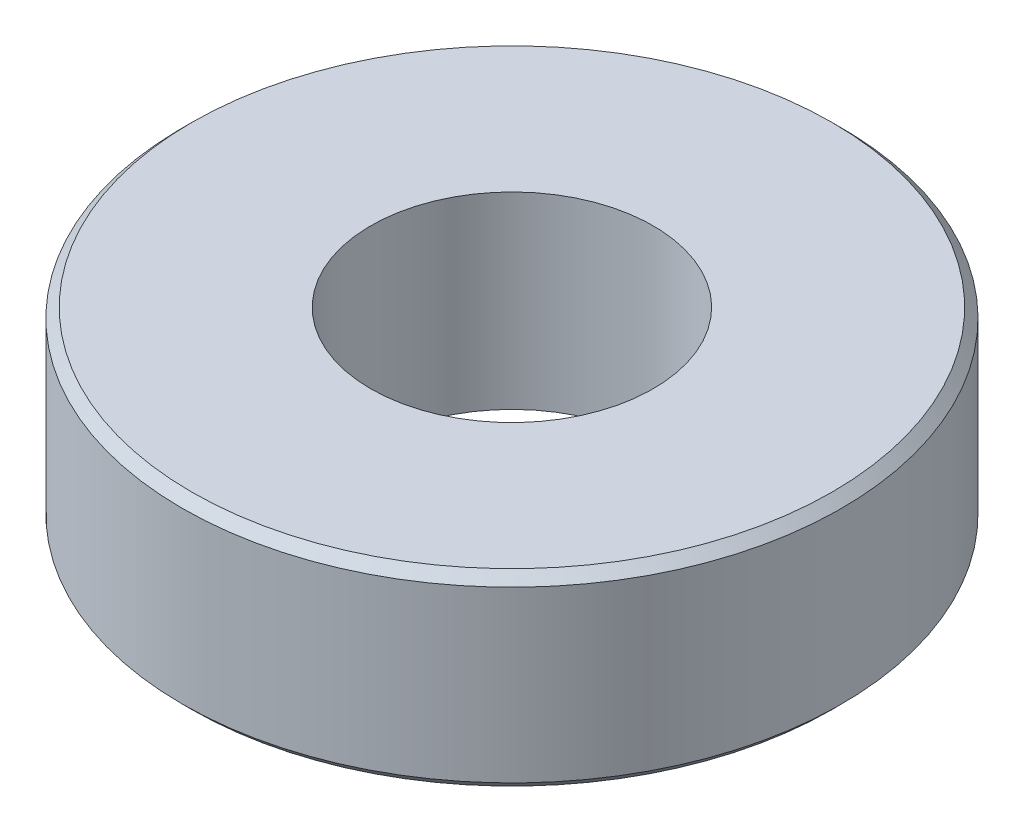
ISO-10303-21;
HEADER;
FILE_DESCRIPTION(('STEP AP214'),'2;1');
FILE_NAME('part.step','',(''),(''),'','','');
FILE_SCHEMA(('AUTOMOTIVE_DESIGN { 1 0 10303 214 1 1 1 1 }'));
ENDSEC;
DATA;
#1=APPLICATION_CONTEXT('core data for automotive mechanical design processes');
#2=APPLICATION_PROTOCOL_DEFINITION('international standard','automotive_design',2000,#1);
#3=PRODUCT_CONTEXT('',#1,'mechanical');
#4=PRODUCT('Part','Part','',(#3));
#5=PRODUCT_RELATED_PRODUCT_CATEGORY('part','',(#4));
#6=PRODUCT_DEFINITION_FORMATION('','',#4);
#7=PRODUCT_DEFINITION_CONTEXT('part definition',#1,'design');
#8=PRODUCT_DEFINITION('design','',#6,#7);
#9=PRODUCT_DEFINITION_SHAPE('','',#8);
#10=(LENGTH_UNIT() NAMED_UNIT(*) SI_UNIT(.MILLI.,.METRE.));
#11=(NAMED_UNIT(*) PLANE_ANGLE_UNIT() SI_UNIT($,.RADIAN.));
#12=(NAMED_UNIT(*) SI_UNIT($,.STERADIAN.) SOLID_ANGLE_UNIT());
#13=UNCERTAINTY_MEASURE_WITH_UNIT(LENGTH_MEASURE(1.E-05),#10,'distance_accuracy_value','');
#14=(GEOMETRIC_REPRESENTATION_CONTEXT(3) GLOBAL_UNCERTAINTY_ASSIGNED_CONTEXT((#13)) GLOBAL_UNIT_ASSIGNED_CONTEXT((#10,
#11,#12)) REPRESENTATION_CONTEXT('',''));
#15=CARTESIAN_POINT('',(0.,0.,0.));
#16=DIRECTION('',(0.,0.,1.));
#17=DIRECTION('',(1.,0.,0.));
#18=AXIS2_PLACEMENT_3D('',#15,#16,#17);
#19=CARTESIAN_POINT('',(0.,4.,0.));
#20=DIRECTION('',(0.,1.,0.));
#21=DIRECTION('',(0.,0.,1.));
#22=AXIS2_PLACEMENT_3D('',#19,#20,#21);
#23=PLANE('',#22);
#24=CARTESIAN_POINT('',(0.,4.,0.));
#25=DIRECTION('',(0.,1.,0.));
#26=DIRECTION('',(0.,0.,1.));
#27=AXIS2_PLACEMENT_3D('',#24,#25,#26);
#28=CIRCLE('',#27,6.8);
#29=CARTESIAN_POINT('',(0.,4.,6.8));
#30=VERTEX_POINT('',#29);
#31=EDGE_CURVE('E10',#30,#30,#28,.T.);
#32=ORIENTED_EDGE('',*,*,#31,.T.);
#33=EDGE_LOOP('',(#32));
#34=FACE_BOUND('',#33,.T.);
#35=CARTESIAN_POINT('',(0.,4.,0.));
#36=DIRECTION('',(0.,1.,0.));
#37=DIRECTION('',(0.,0.,1.));
#38=AXIS2_PLACEMENT_3D('',#35,#36,#37);
#39=CIRCLE('',#38,3.);
#40=CARTESIAN_POINT('',(0.,4.,3.));
#41=VERTEX_POINT('',#40);
#42=EDGE_CURVE('E57',#41,#41,#39,.T.);
#43=ORIENTED_EDGE('',*,*,#42,.F.);
#44=EDGE_LOOP('',(#43));
#45=FACE_BOUND('',#44,.T.);
#46=ADVANCED_FACE('F36',(#34,#45),#23,.T.);
#47=CARTESIAN_POINT('',(0.,0.,0.));
#48=DIRECTION('',(0.,1.,0.));
#49=DIRECTION('',(0.,0.,1.));
#50=AXIS2_PLACEMENT_3D('',#47,#48,#49);
#51=PLANE('',#50);
#52=CARTESIAN_POINT('',(0.,0.,0.));
#53=DIRECTION('',(0.,1.,0.));
#54=DIRECTION('',(0.,0.,1.));
#55=AXIS2_PLACEMENT_3D('',#52,#53,#54);
#56=CIRCLE('',#55,6.8);
#57=CARTESIAN_POINT('',(0.,0.,6.8));
#58=VERTEX_POINT('',#57);
#59=EDGE_CURVE('E44',#58,#58,#56,.F.);
#60=ORIENTED_EDGE('',*,*,#59,.T.);
#61=EDGE_LOOP('',(#60));
#62=FACE_BOUND('',#61,.T.);
#63=CARTESIAN_POINT('',(0.,0.,0.));
#64=DIRECTION('',(0.,1.,0.));
#65=DIRECTION('',(0.,0.,1.));
#66=AXIS2_PLACEMENT_3D('',#63,#64,#65);
#67=CIRCLE('',#66,3.);
#68=CARTESIAN_POINT('',(0.,0.,3.));
#69=VERTEX_POINT('',#68);
#70=EDGE_CURVE('E58',#69,#69,#67,.T.);
#71=ORIENTED_EDGE('',*,*,#70,.T.);
#72=EDGE_LOOP('',(#71));
#73=FACE_BOUND('',#72,.T.);
#74=ADVANCED_FACE('F68',(#62,#73),#51,.F.);
#75=CARTESIAN_POINT('',(0.,4.,0.));
#76=DIRECTION('',(0.,-1.,0.));
#77=DIRECTION('',(0.,0.,-1.));
#78=AXIS2_PLACEMENT_3D('',#75,#76,#77);
#79=CYLINDRICAL_SURFACE('',#78,7.);
#80=CARTESIAN_POINT('',(0.,0.199999999999999,0.));
#81=DIRECTION('',(0.,1.,0.));
#82=DIRECTION('',(0.,0.,1.));
#83=AXIS2_PLACEMENT_3D('',#80,#81,#82);
#84=CIRCLE('',#83,7.);
#85=CARTESIAN_POINT('',(0.,0.199999999999999,7.));
#86=VERTEX_POINT('',#85);
#87=EDGE_CURVE('E48',#86,#86,#84,.T.);
#88=ORIENTED_EDGE('',*,*,#87,.T.);
#89=EDGE_LOOP('',(#88));
#90=FACE_BOUND('',#89,.T.);
#91=CARTESIAN_POINT('',(0.,3.8,0.));
#92=DIRECTION('',(0.,1.,0.));
#93=DIRECTION('',(0.,0.,1.));
#94=AXIS2_PLACEMENT_3D('',#91,#92,#93);
#95=CIRCLE('',#94,7.);
#96=CARTESIAN_POINT('',(0.,3.8,7.));
#97=VERTEX_POINT('',#96);
#98=EDGE_CURVE('E52',#97,#97,#95,.F.);
#99=ORIENTED_EDGE('',*,*,#98,.T.);
#100=EDGE_LOOP('',(#99));
#101=FACE_BOUND('',#100,.T.);
#102=ADVANCED_FACE('F73',(#90,#101),#79,.T.);
#103=CARTESIAN_POINT('',(0.,4.,0.));
#104=DIRECTION('',(0.,-1.,0.));
#105=DIRECTION('',(0.,0.,-1.));
#106=AXIS2_PLACEMENT_3D('',#103,#104,#105);
#107=CYLINDRICAL_SURFACE('',#106,3.);
#108=ORIENTED_EDGE('',*,*,#42,.T.);
#109=EDGE_LOOP('',(#108));
#110=FACE_BOUND('',#109,.T.);
#111=ORIENTED_EDGE('',*,*,#70,.F.);
#112=EDGE_LOOP('',(#111));
#113=FACE_BOUND('',#112,.T.);
#114=ADVANCED_FACE('F64',(#110,#113),#107,.F.);
#115=CARTESIAN_POINT('',(0.,0.199999999999999,0.));
#116=DIRECTION('',(0.,1.,0.));
#117=DIRECTION('',(0.,0.,1.));
#118=AXIS2_PLACEMENT_3D('',#115,#116,#117);
#119=CONICAL_SURFACE('',#118,7.,0.785398163397453);
#120=ORIENTED_EDGE('',*,*,#59,.F.);
#121=EDGE_LOOP('',(#120));
#122=FACE_BOUND('',#121,.T.);
#123=ORIENTED_EDGE('',*,*,#87,.F.);
#124=EDGE_LOOP('',(#123));
#125=FACE_BOUND('',#124,.T.);
#126=ADVANCED_FACE('F80',(#122,#125),#119,.T.);
#127=CARTESIAN_POINT('',(0.,4.,0.));
#128=DIRECTION('',(0.,-1.,0.));
#129=DIRECTION('',(0.,0.,-1.));
#130=AXIS2_PLACEMENT_3D('',#127,#128,#129);
#131=CONICAL_SURFACE('',#130,6.8,0.785398163397438);
#132=ORIENTED_EDGE('',*,*,#98,.F.);
#133=EDGE_LOOP('',(#132));
#134=FACE_BOUND('',#133,.T.);
#135=ORIENTED_EDGE('',*,*,#31,.F.);
#136=EDGE_LOOP('',(#135));
#137=FACE_BOUND('',#136,.T.);
#138=ADVANCED_FACE('F39',(#134,#137),#131,.T.);
#139=CLOSED_SHELL('',(#46,#74,#102,#114,#126,#138));
#140=MANIFOLD_SOLID_BREP('B2',#139);
#141=ADVANCED_BREP_SHAPE_REPRESENTATION('',(#18,#140),#14);
#142=SHAPE_DEFINITION_REPRESENTATION(#9,#141);
ENDSEC;
END-ISO-10303-21;
